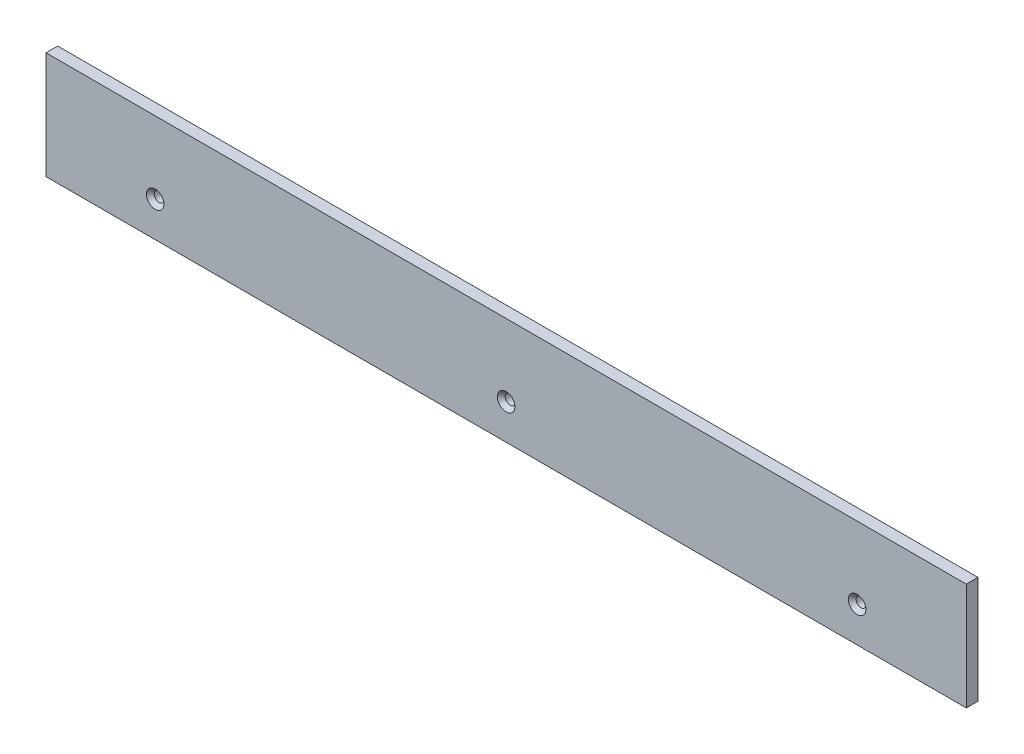
ISO-10303-21;
HEADER;
FILE_DESCRIPTION(('STEP AP214'),'2;1');
FILE_NAME('part.step','',(''),(''),'','','');
FILE_SCHEMA(('AUTOMOTIVE_DESIGN { 1 0 10303 214 1 1 1 1 }'));
ENDSEC;
DATA;
#1=APPLICATION_CONTEXT('core data for automotive mechanical design processes');
#2=APPLICATION_PROTOCOL_DEFINITION('international standard','automotive_design',2000,#1);
#3=PRODUCT_CONTEXT('',#1,'mechanical');
#4=PRODUCT('Part','Part','',(#3));
#5=PRODUCT_RELATED_PRODUCT_CATEGORY('part','',(#4));
#6=PRODUCT_DEFINITION_FORMATION('','',#4);
#7=PRODUCT_DEFINITION_CONTEXT('part definition',#1,'design');
#8=PRODUCT_DEFINITION('design','',#6,#7);
#9=PRODUCT_DEFINITION_SHAPE('','',#8);
#10=(LENGTH_UNIT() NAMED_UNIT(*) SI_UNIT(.MILLI.,.METRE.));
#11=(NAMED_UNIT(*) PLANE_ANGLE_UNIT() SI_UNIT($,.RADIAN.));
#12=(NAMED_UNIT(*) SI_UNIT($,.STERADIAN.) SOLID_ANGLE_UNIT());
#13=UNCERTAINTY_MEASURE_WITH_UNIT(LENGTH_MEASURE(1.E-05),#10,'distance_accuracy_value','');
#14=(GEOMETRIC_REPRESENTATION_CONTEXT(3) GLOBAL_UNCERTAINTY_ASSIGNED_CONTEXT((#13)) GLOBAL_UNIT_ASSIGNED_CONTEXT((#10,
#11,#12)) REPRESENTATION_CONTEXT('',''));
#15=CARTESIAN_POINT('',(0.,0.,0.));
#16=DIRECTION('',(0.,0.,1.));
#17=DIRECTION('',(1.,0.,0.));
#18=AXIS2_PLACEMENT_3D('',#15,#16,#17);
#19=CARTESIAN_POINT('',(236.,-27.5,6.));
#20=DIRECTION('',(-1.,0.,0.));
#21=DIRECTION('',(0.,0.,1.));
#22=AXIS2_PLACEMENT_3D('',#19,#20,#21);
#23=PLANE('',#22);
#24=DIRECTION('',(0.,1.,0.));
#25=VECTOR('',#24,1.);
#26=CARTESIAN_POINT('',(236.,-27.5,0.));
#27=LINE('',#26,#25);
#28=CARTESIAN_POINT('',(236.,-27.5,0.));
#29=VERTEX_POINT('',#28);
#30=CARTESIAN_POINT('',(236.,27.5,0.));
#31=VERTEX_POINT('',#30);
#32=EDGE_CURVE('E112',#29,#31,#27,.T.);
#33=ORIENTED_EDGE('',*,*,#32,.T.);
#34=DIRECTION('',(0.,0.,-1.));
#35=VECTOR('',#34,1.);
#36=CARTESIAN_POINT('',(236.,27.5,6.));
#37=LINE('',#36,#35);
#38=CARTESIAN_POINT('',(236.,27.5,6.));
#39=VERTEX_POINT('',#38);
#40=EDGE_CURVE('E103',#39,#31,#37,.T.);
#41=ORIENTED_EDGE('',*,*,#40,.F.);
#42=DIRECTION('',(0.,1.,0.));
#43=VECTOR('',#42,1.);
#44=CARTESIAN_POINT('',(236.,-27.5,6.));
#45=LINE('',#44,#43);
#46=CARTESIAN_POINT('',(236.,-27.5,6.));
#47=VERTEX_POINT('',#46);
#48=EDGE_CURVE('E97',#47,#39,#45,.T.);
#49=ORIENTED_EDGE('',*,*,#48,.F.);
#50=DIRECTION('',(0.,0.,-1.));
#51=VECTOR('',#50,1.);
#52=CARTESIAN_POINT('',(236.,-27.5,6.));
#53=LINE('',#52,#51);
#54=EDGE_CURVE('E108',#47,#29,#53,.T.);
#55=ORIENTED_EDGE('',*,*,#54,.T.);
#56=EDGE_LOOP('',(#33,#41,#49,#55));
#57=FACE_BOUND('',#56,.T.);
#58=ADVANCED_FACE('F43',(#57),#23,.F.);
#59=CARTESIAN_POINT('',(-236.,27.5,6.));
#60=DIRECTION('',(0.,-1.,0.));
#61=DIRECTION('',(0.,0.,-1.));
#62=AXIS2_PLACEMENT_3D('',#59,#60,#61);
#63=PLANE('',#62);
#64=DIRECTION('',(-1.,0.,0.));
#65=VECTOR('',#64,1.);
#66=CARTESIAN_POINT('',(-236.,27.5,0.));
#67=LINE('',#66,#65);
#68=CARTESIAN_POINT('',(-236.,27.5,0.));
#69=VERTEX_POINT('',#68);
#70=EDGE_CURVE('E102',#31,#69,#67,.T.);
#71=ORIENTED_EDGE('',*,*,#70,.T.);
#72=DIRECTION('',(0.,0.,-1.));
#73=VECTOR('',#72,1.);
#74=CARTESIAN_POINT('',(-236.,27.5,6.));
#75=LINE('',#74,#73);
#76=CARTESIAN_POINT('',(-236.,27.5,6.));
#77=VERTEX_POINT('',#76);
#78=EDGE_CURVE('E100',#77,#69,#75,.T.);
#79=ORIENTED_EDGE('',*,*,#78,.F.);
#80=DIRECTION('',(-1.,0.,0.));
#81=VECTOR('',#80,1.);
#82=CARTESIAN_POINT('',(-236.,27.5,6.));
#83=LINE('',#82,#81);
#84=EDGE_CURVE('E92',#39,#77,#83,.T.);
#85=ORIENTED_EDGE('',*,*,#84,.F.);
#86=ORIENTED_EDGE('',*,*,#40,.T.);
#87=EDGE_LOOP('',(#71,#79,#85,#86));
#88=FACE_BOUND('',#87,.T.);
#89=ADVANCED_FACE('F101',(#88),#63,.F.);
#90=CARTESIAN_POINT('',(-236.,-27.5,6.));
#91=DIRECTION('',(1.,0.,0.));
#92=DIRECTION('',(0.,0.,-1.));
#93=AXIS2_PLACEMENT_3D('',#90,#91,#92);
#94=PLANE('',#93);
#95=DIRECTION('',(0.,-1.,0.));
#96=VECTOR('',#95,1.);
#97=CARTESIAN_POINT('',(-236.,-27.5,0.));
#98=LINE('',#97,#96);
#99=CARTESIAN_POINT('',(-236.,-27.5,0.));
#100=VERTEX_POINT('',#99);
#101=EDGE_CURVE('E78',#69,#100,#98,.T.);
#102=ORIENTED_EDGE('',*,*,#101,.T.);
#103=DIRECTION('',(0.,0.,-1.));
#104=VECTOR('',#103,1.);
#105=CARTESIAN_POINT('',(-236.,-27.5,6.));
#106=LINE('',#105,#104);
#107=CARTESIAN_POINT('',(-236.,-27.5,6.));
#108=VERTEX_POINT('',#107);
#109=EDGE_CURVE('E104',#108,#100,#106,.T.);
#110=ORIENTED_EDGE('',*,*,#109,.F.);
#111=DIRECTION('',(0.,-1.,0.));
#112=VECTOR('',#111,1.);
#113=CARTESIAN_POINT('',(-236.,-27.5,6.));
#114=LINE('',#113,#112);
#115=EDGE_CURVE('E95',#77,#108,#114,.T.);
#116=ORIENTED_EDGE('',*,*,#115,.F.);
#117=ORIENTED_EDGE('',*,*,#78,.T.);
#118=EDGE_LOOP('',(#102,#110,#116,#117));
#119=FACE_BOUND('',#118,.T.);
#120=ADVANCED_FACE('F106',(#119),#94,.F.);
#121=CARTESIAN_POINT('',(-236.,-27.5,6.));
#122=DIRECTION('',(0.,1.,0.));
#123=DIRECTION('',(0.,0.,1.));
#124=AXIS2_PLACEMENT_3D('',#121,#122,#123);
#125=PLANE('',#124);
#126=DIRECTION('',(1.,0.,0.));
#127=VECTOR('',#126,1.);
#128=CARTESIAN_POINT('',(-236.,-27.5,0.));
#129=LINE('',#128,#127);
#130=EDGE_CURVE('E84',#100,#29,#129,.T.);
#131=ORIENTED_EDGE('',*,*,#130,.T.);
#132=ORIENTED_EDGE('',*,*,#54,.F.);
#133=DIRECTION('',(1.,0.,0.));
#134=VECTOR('',#133,1.);
#135=CARTESIAN_POINT('',(-236.,-27.5,6.));
#136=LINE('',#135,#134);
#137=EDGE_CURVE('E61',#108,#47,#136,.T.);
#138=ORIENTED_EDGE('',*,*,#137,.F.);
#139=ORIENTED_EDGE('',*,*,#109,.T.);
#140=EDGE_LOOP('',(#131,#132,#138,#139));
#141=FACE_BOUND('',#140,.T.);
#142=ADVANCED_FACE('F170',(#141),#125,.F.);
#143=CARTESIAN_POINT('',(0.,0.,6.));
#144=DIRECTION('',(0.,0.,-1.));
#145=DIRECTION('',(-1.,0.,0.));
#146=AXIS2_PLACEMENT_3D('',#143,#144,#145);
#147=PLANE('',#146);
#148=CARTESIAN_POINT('',(180.,-9.50000000000001,6.));
#149=DIRECTION('',(0.,0.,-1.));
#150=DIRECTION('',(-1.,0.,0.));
#151=AXIS2_PLACEMENT_3D('',#148,#149,#150);
#152=CIRCLE('',#151,4.50000000000006);
#153=CARTESIAN_POINT('',(175.5,-9.50000000000001,6.));
#154=VERTEX_POINT('',#153);
#155=EDGE_CURVE('E131',#154,#154,#152,.T.);
#156=ORIENTED_EDGE('',*,*,#155,.T.);
#157=EDGE_LOOP('',(#156));
#158=FACE_BOUND('',#157,.T.);
#159=CARTESIAN_POINT('',(0.,-9.50000000000001,6.));
#160=DIRECTION('',(0.,0.,-1.));
#161=DIRECTION('',(-1.,0.,0.));
#162=AXIS2_PLACEMENT_3D('',#159,#160,#161);
#163=CIRCLE('',#162,4.50000000000006);
#164=CARTESIAN_POINT('',(-4.50000000000006,-9.50000000000001,6.));
#165=VERTEX_POINT('',#164);
#166=EDGE_CURVE('E128',#165,#165,#163,.T.);
#167=ORIENTED_EDGE('',*,*,#166,.T.);
#168=EDGE_LOOP('',(#167));
#169=FACE_BOUND('',#168,.T.);
#170=CARTESIAN_POINT('',(-180.,-9.50000000000001,6.));
#171=DIRECTION('',(0.,0.,-1.));
#172=DIRECTION('',(-1.,0.,0.));
#173=AXIS2_PLACEMENT_3D('',#170,#171,#172);
#174=CIRCLE('',#173,4.50000000000006);
#175=CARTESIAN_POINT('',(-184.5,-9.50000000000001,6.));
#176=VERTEX_POINT('',#175);
#177=EDGE_CURVE('E125',#176,#176,#174,.T.);
#178=ORIENTED_EDGE('',*,*,#177,.T.);
#179=EDGE_LOOP('',(#178));
#180=FACE_BOUND('',#179,.T.);
#181=ORIENTED_EDGE('',*,*,#48,.T.);
#182=ORIENTED_EDGE('',*,*,#84,.T.);
#183=ORIENTED_EDGE('',*,*,#115,.T.);
#184=ORIENTED_EDGE('',*,*,#137,.T.);
#185=EDGE_LOOP('',(#181,#182,#183,#184));
#186=FACE_BOUND('',#185,.T.);
#187=ADVANCED_FACE('F93',(#158,#169,#180,#186),#147,.F.);
#188=CARTESIAN_POINT('',(0.,0.,0.));
#189=DIRECTION('',(0.,0.,-1.));
#190=DIRECTION('',(-1.,0.,0.));
#191=AXIS2_PLACEMENT_3D('',#188,#189,#190);
#192=PLANE('',#191);
#193=CARTESIAN_POINT('',(-180.,-9.50000000000001,0.));
#194=DIRECTION('',(0.,0.,1.));
#195=DIRECTION('',(1.,0.,0.));
#196=AXIS2_PLACEMENT_3D('',#193,#194,#195);
#197=CIRCLE('',#196,2.5);
#198=CARTESIAN_POINT('',(-177.5,-9.50000000000001,0.));
#199=VERTEX_POINT('',#198);
#200=EDGE_CURVE('E115',#199,#199,#197,.T.);
#201=ORIENTED_EDGE('',*,*,#200,.T.);
#202=EDGE_LOOP('',(#201));
#203=FACE_BOUND('',#202,.T.);
#204=CARTESIAN_POINT('',(0.,-9.50000000000001,0.));
#205=DIRECTION('',(0.,0.,1.));
#206=DIRECTION('',(1.,0.,0.));
#207=AXIS2_PLACEMENT_3D('',#204,#205,#206);
#208=CIRCLE('',#207,2.5);
#209=CARTESIAN_POINT('',(2.5,-9.50000000000001,0.));
#210=VERTEX_POINT('',#209);
#211=EDGE_CURVE('E194',#210,#210,#208,.T.);
#212=ORIENTED_EDGE('',*,*,#211,.T.);
#213=EDGE_LOOP('',(#212));
#214=FACE_BOUND('',#213,.T.);
#215=CARTESIAN_POINT('',(180.,-9.50000000000001,0.));
#216=DIRECTION('',(0.,0.,1.));
#217=DIRECTION('',(1.,0.,0.));
#218=AXIS2_PLACEMENT_3D('',#215,#216,#217);
#219=CIRCLE('',#218,2.5);
#220=CARTESIAN_POINT('',(182.5,-9.50000000000001,0.));
#221=VERTEX_POINT('',#220);
#222=EDGE_CURVE('E197',#221,#221,#219,.T.);
#223=ORIENTED_EDGE('',*,*,#222,.T.);
#224=EDGE_LOOP('',(#223));
#225=FACE_BOUND('',#224,.T.);
#226=ORIENTED_EDGE('',*,*,#32,.F.);
#227=ORIENTED_EDGE('',*,*,#130,.F.);
#228=ORIENTED_EDGE('',*,*,#101,.F.);
#229=ORIENTED_EDGE('',*,*,#70,.F.);
#230=EDGE_LOOP('',(#226,#227,#228,#229));
#231=FACE_BOUND('',#230,.T.);
#232=ADVANCED_FACE('F173',(#203,#214,#225,#231),#192,.T.);
#233=CARTESIAN_POINT('',(180.,-9.50000000000001,0.));
#234=DIRECTION('',(0.,0.,1.));
#235=DIRECTION('',(1.,0.,0.));
#236=AXIS2_PLACEMENT_3D('',#233,#234,#235);
#237=CYLINDRICAL_SURFACE('',#236,2.5);
#238=CARTESIAN_POINT('',(180.,-9.50000000000001,3.99999999999998));
#239=DIRECTION('',(0.,0.,-1.));
#240=DIRECTION('',(-1.,0.,0.));
#241=AXIS2_PLACEMENT_3D('',#238,#239,#240);
#242=CIRCLE('',#241,2.5);
#243=CARTESIAN_POINT('',(177.5,-9.50000000000001,3.99999999999998));
#244=VERTEX_POINT('',#243);
#245=EDGE_CURVE('E122',#244,#244,#242,.F.);
#246=ORIENTED_EDGE('',*,*,#245,.T.);
#247=EDGE_LOOP('',(#246));
#248=FACE_BOUND('',#247,.T.);
#249=ORIENTED_EDGE('',*,*,#222,.F.);
#250=EDGE_LOOP('',(#249));
#251=FACE_BOUND('',#250,.T.);
#252=ADVANCED_FACE('F176',(#248,#251),#237,.F.);
#253=CARTESIAN_POINT('',(0.,-9.50000000000001,0.));
#254=DIRECTION('',(0.,0.,1.));
#255=DIRECTION('',(1.,0.,0.));
#256=AXIS2_PLACEMENT_3D('',#253,#254,#255);
#257=CYLINDRICAL_SURFACE('',#256,2.5);
#258=CARTESIAN_POINT('',(0.,-9.50000000000001,3.99999999999999));
#259=DIRECTION('',(0.,0.,-1.));
#260=DIRECTION('',(-1.,0.,0.));
#261=AXIS2_PLACEMENT_3D('',#258,#259,#260);
#262=CIRCLE('',#261,2.5);
#263=CARTESIAN_POINT('',(-2.5,-9.50000000000001,3.99999999999999));
#264=VERTEX_POINT('',#263);
#265=EDGE_CURVE('E53',#264,#264,#262,.F.);
#266=ORIENTED_EDGE('',*,*,#265,.T.);
#267=EDGE_LOOP('',(#266));
#268=FACE_BOUND('',#267,.T.);
#269=ORIENTED_EDGE('',*,*,#211,.F.);
#270=EDGE_LOOP('',(#269));
#271=FACE_BOUND('',#270,.T.);
#272=ADVANCED_FACE('F136',(#268,#271),#257,.F.);
#273=CARTESIAN_POINT('',(-180.,-9.50000000000001,0.));
#274=DIRECTION('',(0.,0.,1.));
#275=DIRECTION('',(1.,0.,0.));
#276=AXIS2_PLACEMENT_3D('',#273,#274,#275);
#277=CYLINDRICAL_SURFACE('',#276,2.5);
#278=CARTESIAN_POINT('',(-180.,-9.50000000000001,3.99999999999998));
#279=DIRECTION('',(0.,0.,-1.));
#280=DIRECTION('',(-1.,0.,0.));
#281=AXIS2_PLACEMENT_3D('',#278,#279,#280);
#282=CIRCLE('',#281,2.5);
#283=CARTESIAN_POINT('',(-182.5,-9.50000000000001,3.99999999999998));
#284=VERTEX_POINT('',#283);
#285=EDGE_CURVE('E11',#284,#284,#282,.F.);
#286=ORIENTED_EDGE('',*,*,#285,.T.);
#287=EDGE_LOOP('',(#286));
#288=FACE_BOUND('',#287,.T.);
#289=ORIENTED_EDGE('',*,*,#200,.F.);
#290=EDGE_LOOP('',(#289));
#291=FACE_BOUND('',#290,.T.);
#292=ADVANCED_FACE('F148',(#288,#291),#277,.F.);
#293=CARTESIAN_POINT('',(180.,-9.50000000000001,3.99999999999998));
#294=DIRECTION('',(0.,0.,1.));
#295=DIRECTION('',(1.,0.,0.));
#296=AXIS2_PLACEMENT_3D('',#293,#294,#295);
#297=CONICAL_SURFACE('',#296,2.5,0.78539816339746);
#298=ORIENTED_EDGE('',*,*,#155,.F.);
#299=EDGE_LOOP('',(#298));
#300=FACE_BOUND('',#299,.T.);
#301=ORIENTED_EDGE('',*,*,#245,.F.);
#302=EDGE_LOOP('',(#301));
#303=FACE_BOUND('',#302,.T.);
#304=ADVANCED_FACE('F141',(#300,#303),#297,.F.);
#305=CARTESIAN_POINT('',(0.,-9.50000000000001,3.99999999999999));
#306=DIRECTION('',(0.,0.,1.));
#307=DIRECTION('',(1.,0.,0.));
#308=AXIS2_PLACEMENT_3D('',#305,#306,#307);
#309=CONICAL_SURFACE('',#308,2.5,0.78539816339746);
#310=ORIENTED_EDGE('',*,*,#166,.F.);
#311=EDGE_LOOP('',(#310));
#312=FACE_BOUND('',#311,.T.);
#313=ORIENTED_EDGE('',*,*,#265,.F.);
#314=EDGE_LOOP('',(#313));
#315=FACE_BOUND('',#314,.T.);
#316=ADVANCED_FACE('F139',(#312,#315),#309,.F.);
#317=CARTESIAN_POINT('',(-180.,-9.50000000000001,3.99999999999998));
#318=DIRECTION('',(0.,0.,1.));
#319=DIRECTION('',(1.,0.,0.));
#320=AXIS2_PLACEMENT_3D('',#317,#318,#319);
#321=CONICAL_SURFACE('',#320,2.5,0.78539816339746);
#322=ORIENTED_EDGE('',*,*,#177,.F.);
#323=EDGE_LOOP('',(#322));
#324=FACE_BOUND('',#323,.T.);
#325=ORIENTED_EDGE('',*,*,#285,.F.);
#326=EDGE_LOOP('',(#325));
#327=FACE_BOUND('',#326,.T.);
#328=ADVANCED_FACE('F46',(#324,#327),#321,.F.);
#329=CLOSED_SHELL('',(#58,#89,#120,#142,#187,#232,#252,#272,#292,#304,#316,#328));
#330=MANIFOLD_SOLID_BREP('B2',#329);
#331=ADVANCED_BREP_SHAPE_REPRESENTATION('',(#18,#330),#14);
#332=SHAPE_DEFINITION_REPRESENTATION(#9,#331);
ENDSEC;
END-ISO-10303-21;
